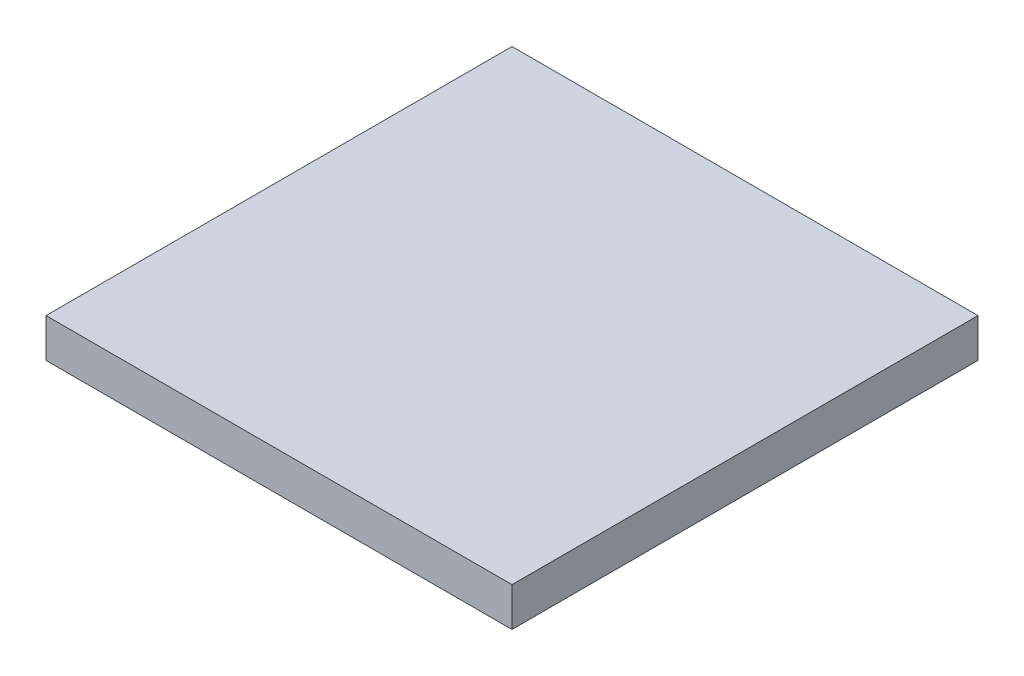
ISO-10303-21;
HEADER;
FILE_DESCRIPTION(('STEP AP214'),'2;1');
FILE_NAME('part.step','',(''),(''),'','','');
FILE_SCHEMA(('AUTOMOTIVE_DESIGN { 1 0 10303 214 1 1 1 1 }'));
ENDSEC;
DATA;
#1=APPLICATION_CONTEXT('core data for automotive mechanical design processes');
#2=APPLICATION_PROTOCOL_DEFINITION('international standard','automotive_design',2000,#1);
#3=PRODUCT_CONTEXT('',#1,'mechanical');
#4=PRODUCT('Part','Part','',(#3));
#5=PRODUCT_RELATED_PRODUCT_CATEGORY('part','',(#4));
#6=PRODUCT_DEFINITION_FORMATION('','',#4);
#7=PRODUCT_DEFINITION_CONTEXT('part definition',#1,'design');
#8=PRODUCT_DEFINITION('design','',#6,#7);
#9=PRODUCT_DEFINITION_SHAPE('','',#8);
#10=(LENGTH_UNIT() NAMED_UNIT(*) SI_UNIT(.MILLI.,.METRE.));
#11=(NAMED_UNIT(*) PLANE_ANGLE_UNIT() SI_UNIT($,.RADIAN.));
#12=(NAMED_UNIT(*) SI_UNIT($,.STERADIAN.) SOLID_ANGLE_UNIT());
#13=UNCERTAINTY_MEASURE_WITH_UNIT(LENGTH_MEASURE(1.E-05),#10,'distance_accuracy_value','');
#14=(GEOMETRIC_REPRESENTATION_CONTEXT(3) GLOBAL_UNCERTAINTY_ASSIGNED_CONTEXT((#13)) GLOBAL_UNIT_ASSIGNED_CONTEXT((#10,
#11,#12)) REPRESENTATION_CONTEXT('',''));
#15=CARTESIAN_POINT('',(0.,0.,0.));
#16=DIRECTION('',(0.,0.,1.));
#17=DIRECTION('',(1.,0.,0.));
#18=AXIS2_PLACEMENT_3D('',#15,#16,#17);
#19=CARTESIAN_POINT('',(-3.21362229102167,0.5,-2.64705882352941));
#20=DIRECTION('',(1.,0.,0.));
#21=DIRECTION('',(0.,0.,-1.));
#22=AXIS2_PLACEMENT_3D('',#19,#20,#21);
#23=PLANE('',#22);
#24=DIRECTION('',(0.,0.,1.));
#25=VECTOR('',#24,1.);
#26=CARTESIAN_POINT('',(-3.21362229102167,0.,-2.64705882352941));
#27=LINE('',#26,#25);
#28=CARTESIAN_POINT('',(-3.21362229102167,0.,-2.64705882352941));
#29=VERTEX_POINT('',#28);
#30=CARTESIAN_POINT('',(-3.21362229102167,0.,3.35294117647059));
#31=VERTEX_POINT('',#30);
#32=EDGE_CURVE('E107',#29,#31,#27,.T.);
#33=ORIENTED_EDGE('',*,*,#32,.T.);
#34=DIRECTION('',(0.,-1.,0.));
#35=VECTOR('',#34,1.);
#36=CARTESIAN_POINT('',(-3.21362229102167,0.5,3.35294117647059));
#37=LINE('',#36,#35);
#38=CARTESIAN_POINT('',(-3.21362229102167,0.5,3.35294117647059));
#39=VERTEX_POINT('',#38);
#40=EDGE_CURVE('E11',#39,#31,#37,.T.);
#41=ORIENTED_EDGE('',*,*,#40,.F.);
#42=DIRECTION('',(0.,0.,1.));
#43=VECTOR('',#42,1.);
#44=CARTESIAN_POINT('',(-3.21362229102167,0.5,-2.64705882352941));
#45=LINE('',#44,#43);
#46=CARTESIAN_POINT('',(-3.21362229102167,0.5,-2.64705882352941));
#47=VERTEX_POINT('',#46);
#48=EDGE_CURVE('E91',#47,#39,#45,.T.);
#49=ORIENTED_EDGE('',*,*,#48,.F.);
#50=DIRECTION('',(0.,-1.,0.));
#51=VECTOR('',#50,1.);
#52=CARTESIAN_POINT('',(-3.21362229102167,0.5,-2.64705882352941));
#53=LINE('',#52,#51);
#54=EDGE_CURVE('E103',#47,#29,#53,.T.);
#55=ORIENTED_EDGE('',*,*,#54,.T.);
#56=EDGE_LOOP('',(#33,#41,#49,#55));
#57=FACE_BOUND('',#56,.T.);
#58=ADVANCED_FACE('F39',(#57),#23,.F.);
#59=CARTESIAN_POINT('',(-3.21362229102167,0.5,3.35294117647059));
#60=DIRECTION('',(0.,0.,-1.));
#61=DIRECTION('',(-1.,0.,0.));
#62=AXIS2_PLACEMENT_3D('',#59,#60,#61);
#63=PLANE('',#62);
#64=DIRECTION('',(1.,0.,0.));
#65=VECTOR('',#64,1.);
#66=CARTESIAN_POINT('',(-3.21362229102167,0.,3.35294117647059));
#67=LINE('',#66,#65);
#68=CARTESIAN_POINT('',(2.78637770897833,0.,3.35294117647059));
#69=VERTEX_POINT('',#68);
#70=EDGE_CURVE('E96',#31,#69,#67,.T.);
#71=ORIENTED_EDGE('',*,*,#70,.T.);
#72=DIRECTION('',(0.,-1.,0.));
#73=VECTOR('',#72,1.);
#74=CARTESIAN_POINT('',(2.78637770897833,0.5,3.35294117647059));
#75=LINE('',#74,#73);
#76=CARTESIAN_POINT('',(2.78637770897833,0.5,3.35294117647059));
#77=VERTEX_POINT('',#76);
#78=EDGE_CURVE('E48',#77,#69,#75,.T.);
#79=ORIENTED_EDGE('',*,*,#78,.F.);
#80=DIRECTION('',(1.,0.,0.));
#81=VECTOR('',#80,1.);
#82=CARTESIAN_POINT('',(-3.21362229102167,0.5,3.35294117647059));
#83=LINE('',#82,#81);
#84=EDGE_CURVE('E86',#39,#77,#83,.T.);
#85=ORIENTED_EDGE('',*,*,#84,.F.);
#86=ORIENTED_EDGE('',*,*,#40,.T.);
#87=EDGE_LOOP('',(#71,#79,#85,#86));
#88=FACE_BOUND('',#87,.T.);
#89=ADVANCED_FACE('F95',(#88),#63,.F.);
#90=CARTESIAN_POINT('',(2.78637770897833,0.5,-2.64705882352941));
#91=DIRECTION('',(-1.,0.,0.));
#92=DIRECTION('',(0.,0.,1.));
#93=AXIS2_PLACEMENT_3D('',#90,#91,#92);
#94=PLANE('',#93);
#95=DIRECTION('',(0.,0.,-1.));
#96=VECTOR('',#95,1.);
#97=CARTESIAN_POINT('',(2.78637770897833,0.,-2.64705882352941));
#98=LINE('',#97,#96);
#99=CARTESIAN_POINT('',(2.78637770897833,0.,-2.64705882352941));
#100=VERTEX_POINT('',#99);
#101=EDGE_CURVE('E73',#69,#100,#98,.T.);
#102=ORIENTED_EDGE('',*,*,#101,.T.);
#103=DIRECTION('',(0.,-1.,0.));
#104=VECTOR('',#103,1.);
#105=CARTESIAN_POINT('',(2.78637770897833,0.5,-2.64705882352941));
#106=LINE('',#105,#104);
#107=CARTESIAN_POINT('',(2.78637770897833,0.5,-2.64705882352941));
#108=VERTEX_POINT('',#107);
#109=EDGE_CURVE('E98',#108,#100,#106,.T.);
#110=ORIENTED_EDGE('',*,*,#109,.F.);
#111=DIRECTION('',(0.,0.,-1.));
#112=VECTOR('',#111,1.);
#113=CARTESIAN_POINT('',(2.78637770897833,0.5,-2.64705882352941));
#114=LINE('',#113,#112);
#115=EDGE_CURVE('E89',#77,#108,#114,.T.);
#116=ORIENTED_EDGE('',*,*,#115,.F.);
#117=ORIENTED_EDGE('',*,*,#78,.T.);
#118=EDGE_LOOP('',(#102,#110,#116,#117));
#119=FACE_BOUND('',#118,.T.);
#120=ADVANCED_FACE('F99',(#119),#94,.F.);
#121=CARTESIAN_POINT('',(-3.21362229102167,0.5,-2.64705882352941));
#122=DIRECTION('',(0.,0.,1.));
#123=DIRECTION('',(1.,0.,0.));
#124=AXIS2_PLACEMENT_3D('',#121,#122,#123);
#125=PLANE('',#124);
#126=DIRECTION('',(-1.,0.,0.));
#127=VECTOR('',#126,1.);
#128=CARTESIAN_POINT('',(-3.21362229102167,0.,-2.64705882352941));
#129=LINE('',#128,#127);
#130=EDGE_CURVE('E79',#100,#29,#129,.T.);
#131=ORIENTED_EDGE('',*,*,#130,.T.);
#132=ORIENTED_EDGE('',*,*,#54,.F.);
#133=DIRECTION('',(-1.,0.,0.));
#134=VECTOR('',#133,1.);
#135=CARTESIAN_POINT('',(-3.21362229102167,0.5,-2.64705882352941));
#136=LINE('',#135,#134);
#137=EDGE_CURVE('E56',#108,#47,#136,.T.);
#138=ORIENTED_EDGE('',*,*,#137,.F.);
#139=ORIENTED_EDGE('',*,*,#109,.T.);
#140=EDGE_LOOP('',(#131,#132,#138,#139));
#141=FACE_BOUND('',#140,.T.);
#142=ADVANCED_FACE('F120',(#141),#125,.F.);
#143=CARTESIAN_POINT('',(0.,0.5,0.));
#144=DIRECTION('',(0.,1.,0.));
#145=DIRECTION('',(0.,0.,1.));
#146=AXIS2_PLACEMENT_3D('',#143,#144,#145);
#147=PLANE('',#146);
#148=ORIENTED_EDGE('',*,*,#48,.T.);
#149=ORIENTED_EDGE('',*,*,#84,.T.);
#150=ORIENTED_EDGE('',*,*,#115,.T.);
#151=ORIENTED_EDGE('',*,*,#137,.T.);
#152=EDGE_LOOP('',(#148,#149,#150,#151));
#153=FACE_BOUND('',#152,.T.);
#154=ADVANCED_FACE('F87',(#153),#147,.T.);
#155=CARTESIAN_POINT('',(0.,0.,0.));
#156=DIRECTION('',(0.,1.,0.));
#157=DIRECTION('',(0.,0.,1.));
#158=AXIS2_PLACEMENT_3D('',#155,#156,#157);
#159=PLANE('',#158);
#160=ORIENTED_EDGE('',*,*,#32,.F.);
#161=ORIENTED_EDGE('',*,*,#130,.F.);
#162=ORIENTED_EDGE('',*,*,#101,.F.);
#163=ORIENTED_EDGE('',*,*,#70,.F.);
#164=EDGE_LOOP('',(#160,#161,#162,#163));
#165=FACE_BOUND('',#164,.T.);
#166=ADVANCED_FACE('F123',(#165),#159,.F.);
#167=CLOSED_SHELL('',(#58,#89,#120,#142,#154,#166));
#168=MANIFOLD_SOLID_BREP('B2',#167);
#169=ADVANCED_BREP_SHAPE_REPRESENTATION('',(#18,#168),#14);
#170=SHAPE_DEFINITION_REPRESENTATION(#9,#169);
ENDSEC;
END-ISO-10303-21;
